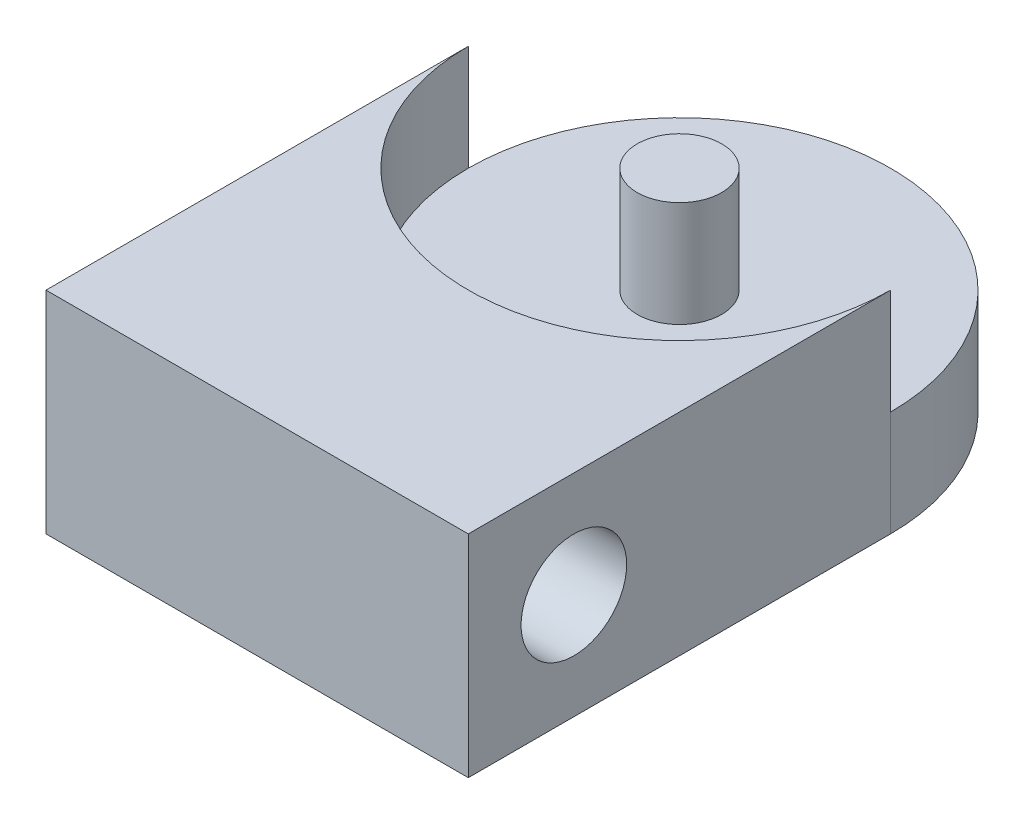
ISO-10303-21;
HEADER;
FILE_DESCRIPTION(('STEP AP214'),'2;1');
FILE_NAME('part.step','',(''),(''),'','','');
FILE_SCHEMA(('AUTOMOTIVE_DESIGN { 1 0 10303 214 1 1 1 1 }'));
ENDSEC;
DATA;
#1=APPLICATION_CONTEXT('core data for automotive mechanical design processes');
#2=APPLICATION_PROTOCOL_DEFINITION('international standard','automotive_design',2000,#1);
#3=PRODUCT_CONTEXT('',#1,'mechanical');
#4=PRODUCT('Part','Part','',(#3));
#5=PRODUCT_RELATED_PRODUCT_CATEGORY('part','',(#4));
#6=PRODUCT_DEFINITION_FORMATION('','',#4);
#7=PRODUCT_DEFINITION_CONTEXT('part definition',#1,'design');
#8=PRODUCT_DEFINITION('design','',#6,#7);
#9=PRODUCT_DEFINITION_SHAPE('','',#8);
#10=(LENGTH_UNIT() NAMED_UNIT(*) SI_UNIT(.MILLI.,.METRE.));
#11=(NAMED_UNIT(*) PLANE_ANGLE_UNIT() SI_UNIT($,.RADIAN.));
#12=(NAMED_UNIT(*) SI_UNIT($,.STERADIAN.) SOLID_ANGLE_UNIT());
#13=UNCERTAINTY_MEASURE_WITH_UNIT(LENGTH_MEASURE(1.E-05),#10,'distance_accuracy_value','');
#14=(GEOMETRIC_REPRESENTATION_CONTEXT(3) GLOBAL_UNCERTAINTY_ASSIGNED_CONTEXT((#13)) GLOBAL_UNIT_ASSIGNED_CONTEXT((#10,
#11,#12)) REPRESENTATION_CONTEXT('',''));
#15=CARTESIAN_POINT('',(0.,0.,0.));
#16=DIRECTION('',(0.,0.,1.));
#17=DIRECTION('',(1.,0.,0.));
#18=AXIS2_PLACEMENT_3D('',#15,#16,#17);
#19=CARTESIAN_POINT('',(10.,5.,0.));
#20=DIRECTION('',(-1.,0.,0.));
#21=DIRECTION('',(0.,0.,1.));
#22=AXIS2_PLACEMENT_3D('',#19,#20,#21);
#23=PLANE('',#22);
#24=CARTESIAN_POINT('',(10.,5.,15.));
#25=DIRECTION('',(1.,0.,0.));
#26=DIRECTION('',(0.,0.,-1.));
#27=AXIS2_PLACEMENT_3D('',#24,#25,#26);
#28=CIRCLE('',#27,2.5);
#29=CARTESIAN_POINT('',(10.,5.,12.5));
#30=VERTEX_POINT('',#29);
#31=EDGE_CURVE('E178',#30,#30,#28,.T.);
#32=ORIENTED_EDGE('',*,*,#31,.F.);
#33=EDGE_LOOP('',(#32));
#34=FACE_BOUND('',#33,.T.);
#35=DIRECTION('',(0.,0.,-1.));
#36=VECTOR('',#35,1.);
#37=CARTESIAN_POINT('',(10.,0.,0.));
#38=LINE('',#37,#36);
#39=CARTESIAN_POINT('',(10.,0.,20.));
#40=VERTEX_POINT('',#39);
#41=CARTESIAN_POINT('',(10.,0.,0.));
#42=VERTEX_POINT('',#41);
#43=EDGE_CURVE('E115',#40,#42,#38,.T.);
#44=ORIENTED_EDGE('',*,*,#43,.T.);
#45=DIRECTION('',(0.,-1.,0.));
#46=VECTOR('',#45,1.);
#47=CARTESIAN_POINT('',(10.,5.,0.));
#48=LINE('',#47,#46);
#49=CARTESIAN_POINT('',(10.,5.,0.));
#50=VERTEX_POINT('',#49);
#51=EDGE_CURVE('E12',#50,#42,#48,.T.);
#52=ORIENTED_EDGE('',*,*,#51,.F.);
#53=DIRECTION('',(0.,-1.,0.));
#54=VECTOR('',#53,1.);
#55=CARTESIAN_POINT('',(10.,10.,0.));
#56=LINE('',#55,#54);
#57=CARTESIAN_POINT('',(10.,10.,0.));
#58=VERTEX_POINT('',#57);
#59=EDGE_CURVE('E140',#58,#50,#56,.T.);
#60=ORIENTED_EDGE('',*,*,#59,.F.);
#61=DIRECTION('',(0.,0.,-1.));
#62=VECTOR('',#61,1.);
#63=CARTESIAN_POINT('',(10.,10.,0.));
#64=LINE('',#63,#62);
#65=CARTESIAN_POINT('',(10.,10.,20.));
#66=VERTEX_POINT('',#65);
#67=EDGE_CURVE('E130',#66,#58,#64,.T.);
#68=ORIENTED_EDGE('',*,*,#67,.F.);
#69=DIRECTION('',(0.,-1.,0.));
#70=VECTOR('',#69,1.);
#71=CARTESIAN_POINT('',(10.,5.,20.));
#72=LINE('',#71,#70);
#73=EDGE_CURVE('E110',#66,#40,#72,.T.);
#74=ORIENTED_EDGE('',*,*,#73,.T.);
#75=EDGE_LOOP('',(#44,#52,#60,#68,#74));
#76=FACE_BOUND('',#75,.T.);
#77=ADVANCED_FACE('F54',(#34,#76),#23,.F.);
#78=CARTESIAN_POINT('',(0.,5.,0.));
#79=DIRECTION('',(0.,-1.,0.));
#80=DIRECTION('',(0.,0.,-1.));
#81=AXIS2_PLACEMENT_3D('',#78,#79,#80);
#82=CYLINDRICAL_SURFACE('',#81,10.);
#83=CARTESIAN_POINT('',(0.,0.,0.));
#84=DIRECTION('',(0.,1.,0.));
#85=DIRECTION('',(0.,0.,1.));
#86=AXIS2_PLACEMENT_3D('',#83,#84,#85);
#87=CIRCLE('',#86,10.);
#88=CARTESIAN_POINT('',(-10.,0.,0.));
#89=VERTEX_POINT('',#88);
#90=EDGE_CURVE('E100',#42,#89,#87,.T.);
#91=ORIENTED_EDGE('',*,*,#90,.T.);
#92=DIRECTION('',(0.,-1.,0.));
#93=VECTOR('',#92,1.);
#94=CARTESIAN_POINT('',(-10.,5.,0.));
#95=LINE('',#94,#93);
#96=CARTESIAN_POINT('',(-10.,5.,0.));
#97=VERTEX_POINT('',#96);
#98=EDGE_CURVE('E63',#97,#89,#95,.T.);
#99=ORIENTED_EDGE('',*,*,#98,.F.);
#100=CARTESIAN_POINT('',(0.,5.,0.));
#101=DIRECTION('',(0.,1.,0.));
#102=DIRECTION('',(0.,0.,1.));
#103=AXIS2_PLACEMENT_3D('',#100,#101,#102);
#104=CIRCLE('',#103,10.);
#105=EDGE_CURVE('E69',#50,#97,#104,.T.);
#106=ORIENTED_EDGE('',*,*,#105,.F.);
#107=ORIENTED_EDGE('',*,*,#51,.T.);
#108=EDGE_LOOP('',(#91,#99,#106,#107));
#109=FACE_BOUND('',#108,.T.);
#110=ADVANCED_FACE('F167',(#109),#82,.T.);
#111=CARTESIAN_POINT('',(-10.,5.,0.));
#112=DIRECTION('',(1.,0.,0.));
#113=DIRECTION('',(0.,0.,-1.));
#114=AXIS2_PLACEMENT_3D('',#111,#112,#113);
#115=PLANE('',#114);
#116=CARTESIAN_POINT('',(-10.,5.,15.));
#117=DIRECTION('',(1.,0.,0.));
#118=DIRECTION('',(0.,0.,-1.));
#119=AXIS2_PLACEMENT_3D('',#116,#117,#118);
#120=CIRCLE('',#119,2.5);
#121=CARTESIAN_POINT('',(-10.,5.,12.5));
#122=VERTEX_POINT('',#121);
#123=EDGE_CURVE('E149',#122,#122,#120,.T.);
#124=ORIENTED_EDGE('',*,*,#123,.T.);
#125=EDGE_LOOP('',(#124));
#126=FACE_BOUND('',#125,.T.);
#127=DIRECTION('',(0.,0.,1.));
#128=VECTOR('',#127,1.);
#129=CARTESIAN_POINT('',(-10.,0.,0.));
#130=LINE('',#129,#128);
#131=CARTESIAN_POINT('',(-10.,0.,20.));
#132=VERTEX_POINT('',#131);
#133=EDGE_CURVE('E88',#89,#132,#130,.T.);
#134=ORIENTED_EDGE('',*,*,#133,.T.);
#135=DIRECTION('',(0.,-1.,0.));
#136=VECTOR('',#135,1.);
#137=CARTESIAN_POINT('',(-10.,5.,20.));
#138=LINE('',#137,#136);
#139=CARTESIAN_POINT('',(-10.,10.,20.));
#140=VERTEX_POINT('',#139);
#141=EDGE_CURVE('E93',#140,#132,#138,.T.);
#142=ORIENTED_EDGE('',*,*,#141,.F.);
#143=DIRECTION('',(0.,0.,1.));
#144=VECTOR('',#143,1.);
#145=CARTESIAN_POINT('',(-10.,10.,0.));
#146=LINE('',#145,#144);
#147=CARTESIAN_POINT('',(-10.,10.,0.));
#148=VERTEX_POINT('',#147);
#149=EDGE_CURVE('E135',#148,#140,#146,.T.);
#150=ORIENTED_EDGE('',*,*,#149,.F.);
#151=DIRECTION('',(0.,-1.,0.));
#152=VECTOR('',#151,1.);
#153=CARTESIAN_POINT('',(-10.,10.,0.));
#154=LINE('',#153,#152);
#155=EDGE_CURVE('E153',#148,#97,#154,.T.);
#156=ORIENTED_EDGE('',*,*,#155,.T.);
#157=ORIENTED_EDGE('',*,*,#98,.T.);
#158=EDGE_LOOP('',(#134,#142,#150,#156,#157));
#159=FACE_BOUND('',#158,.T.);
#160=ADVANCED_FACE('F90',(#126,#159),#115,.F.);
#161=CARTESIAN_POINT('',(0.,5.,20.));
#162=DIRECTION('',(0.,0.,-1.));
#163=DIRECTION('',(-1.,0.,0.));
#164=AXIS2_PLACEMENT_3D('',#161,#162,#163);
#165=PLANE('',#164);
#166=DIRECTION('',(1.,0.,0.));
#167=VECTOR('',#166,1.);
#168=CARTESIAN_POINT('',(0.,0.,20.));
#169=LINE('',#168,#167);
#170=EDGE_CURVE('E99',#132,#40,#169,.T.);
#171=ORIENTED_EDGE('',*,*,#170,.T.);
#172=ORIENTED_EDGE('',*,*,#73,.F.);
#173=DIRECTION('',(1.,0.,0.));
#174=VECTOR('',#173,1.);
#175=CARTESIAN_POINT('',(0.,10.,20.));
#176=LINE('',#175,#174);
#177=EDGE_CURVE('E108',#140,#66,#176,.T.);
#178=ORIENTED_EDGE('',*,*,#177,.F.);
#179=ORIENTED_EDGE('',*,*,#141,.T.);
#180=EDGE_LOOP('',(#171,#172,#178,#179));
#181=FACE_BOUND('',#180,.T.);
#182=ADVANCED_FACE('F104',(#181),#165,.F.);
#183=CARTESIAN_POINT('',(0.,5.,0.));
#184=DIRECTION('',(0.,1.,0.));
#185=DIRECTION('',(0.,0.,1.));
#186=AXIS2_PLACEMENT_3D('',#183,#184,#185);
#187=PLANE('',#186);
#188=CARTESIAN_POINT('',(0.,5.,0.));
#189=DIRECTION('',(0.,1.,0.));
#190=DIRECTION('',(0.,0.,1.));
#191=AXIS2_PLACEMENT_3D('',#188,#189,#190);
#192=CIRCLE('',#191,10.);
#193=EDGE_CURVE('E146',#97,#50,#192,.T.);
#194=ORIENTED_EDGE('',*,*,#193,.T.);
#195=ORIENTED_EDGE('',*,*,#105,.T.);
#196=EDGE_LOOP('',(#194,#195));
#197=FACE_BOUND('',#196,.T.);
#198=CARTESIAN_POINT('',(0.,5.,0.));
#199=DIRECTION('',(0.,1.,0.));
#200=DIRECTION('',(0.,0.,1.));
#201=AXIS2_PLACEMENT_3D('',#198,#199,#200);
#202=CIRCLE('',#201,2.);
#203=CARTESIAN_POINT('',(0.,5.,2.));
#204=VERTEX_POINT('',#203);
#205=EDGE_CURVE('E156',#204,#204,#202,.T.);
#206=ORIENTED_EDGE('',*,*,#205,.F.);
#207=EDGE_LOOP('',(#206));
#208=FACE_BOUND('',#207,.T.);
#209=ADVANCED_FACE('F204',(#197,#208),#187,.T.);
#210=CARTESIAN_POINT('',(0.,0.,0.));
#211=DIRECTION('',(0.,1.,0.));
#212=DIRECTION('',(0.,0.,1.));
#213=AXIS2_PLACEMENT_3D('',#210,#211,#212);
#214=PLANE('',#213);
#215=ORIENTED_EDGE('',*,*,#43,.F.);
#216=ORIENTED_EDGE('',*,*,#170,.F.);
#217=ORIENTED_EDGE('',*,*,#133,.F.);
#218=ORIENTED_EDGE('',*,*,#90,.F.);
#219=EDGE_LOOP('',(#215,#216,#217,#218));
#220=FACE_BOUND('',#219,.T.);
#221=ADVANCED_FACE('F113',(#220),#214,.F.);
#222=CARTESIAN_POINT('',(0.,10.,0.));
#223=DIRECTION('',(0.,-1.,0.));
#224=DIRECTION('',(0.,0.,-1.));
#225=AXIS2_PLACEMENT_3D('',#222,#223,#224);
#226=CYLINDRICAL_SURFACE('',#225,2.);
#227=CARTESIAN_POINT('',(0.,10.,0.));
#228=DIRECTION('',(0.,1.,0.));
#229=DIRECTION('',(0.,0.,1.));
#230=AXIS2_PLACEMENT_3D('',#227,#228,#229);
#231=CIRCLE('',#230,2.);
#232=CARTESIAN_POINT('',(0.,10.,2.));
#233=VERTEX_POINT('',#232);
#234=EDGE_CURVE('E157',#233,#233,#231,.T.);
#235=ORIENTED_EDGE('',*,*,#234,.F.);
#236=EDGE_LOOP('',(#235));
#237=FACE_BOUND('',#236,.T.);
#238=ORIENTED_EDGE('',*,*,#205,.T.);
#239=EDGE_LOOP('',(#238));
#240=FACE_BOUND('',#239,.T.);
#241=ADVANCED_FACE('F207',(#237,#240),#226,.T.);
#242=CARTESIAN_POINT('',(0.,10.,0.));
#243=DIRECTION('',(0.,1.,0.));
#244=DIRECTION('',(0.,0.,1.));
#245=AXIS2_PLACEMENT_3D('',#242,#243,#244);
#246=PLANE('',#245);
#247=ORIENTED_EDGE('',*,*,#234,.T.);
#248=EDGE_LOOP('',(#247));
#249=FACE_BOUND('',#248,.T.);
#250=ADVANCED_FACE('F212',(#249),#246,.T.);
#251=CARTESIAN_POINT('',(0.,10.,0.));
#252=DIRECTION('',(0.,-1.,0.));
#253=DIRECTION('',(0.,0.,-1.));
#254=AXIS2_PLACEMENT_3D('',#251,#252,#253);
#255=CYLINDRICAL_SURFACE('',#254,10.);
#256=ORIENTED_EDGE('',*,*,#193,.F.);
#257=ORIENTED_EDGE('',*,*,#155,.F.);
#258=CARTESIAN_POINT('',(0.,10.,0.));
#259=DIRECTION('',(0.,1.,0.));
#260=DIRECTION('',(0.,0.,1.));
#261=AXIS2_PLACEMENT_3D('',#258,#259,#260);
#262=CIRCLE('',#261,10.);
#263=EDGE_CURVE('E142',#148,#58,#262,.T.);
#264=ORIENTED_EDGE('',*,*,#263,.T.);
#265=ORIENTED_EDGE('',*,*,#59,.T.);
#266=EDGE_LOOP('',(#256,#257,#264,#265));
#267=FACE_BOUND('',#266,.T.);
#268=ADVANCED_FACE('F175',(#267),#255,.F.);
#269=CARTESIAN_POINT('',(0.,10.,0.));
#270=DIRECTION('',(0.,1.,0.));
#271=DIRECTION('',(0.,0.,1.));
#272=AXIS2_PLACEMENT_3D('',#269,#270,#271);
#273=PLANE('',#272);
#274=ORIENTED_EDGE('',*,*,#263,.F.);
#275=ORIENTED_EDGE('',*,*,#149,.T.);
#276=ORIENTED_EDGE('',*,*,#177,.T.);
#277=ORIENTED_EDGE('',*,*,#67,.T.);
#278=EDGE_LOOP('',(#274,#275,#276,#277));
#279=FACE_BOUND('',#278,.T.);
#280=ADVANCED_FACE('F134',(#279),#273,.T.);
#281=CARTESIAN_POINT('',(-10.,5.,15.));
#282=DIRECTION('',(1.,0.,0.));
#283=DIRECTION('',(0.,0.,-1.));
#284=AXIS2_PLACEMENT_3D('',#281,#282,#283);
#285=CYLINDRICAL_SURFACE('',#284,2.5);
#286=ORIENTED_EDGE('',*,*,#123,.F.);
#287=EDGE_LOOP('',(#286));
#288=FACE_BOUND('',#287,.T.);
#289=ORIENTED_EDGE('',*,*,#31,.T.);
#290=EDGE_LOOP('',(#289));
#291=FACE_BOUND('',#290,.T.);
#292=ADVANCED_FACE('F187',(#288,#291),#285,.F.);
#293=CLOSED_SHELL('',(#77,#110,#160,#182,#209,#221,#241,#250,#268,#280,#292));
#294=MANIFOLD_SOLID_BREP('B2',#293);
#295=ADVANCED_BREP_SHAPE_REPRESENTATION('',(#18,#294),#14);
#296=SHAPE_DEFINITION_REPRESENTATION(#9,#295);
ENDSEC;
END-ISO-10303-21;
